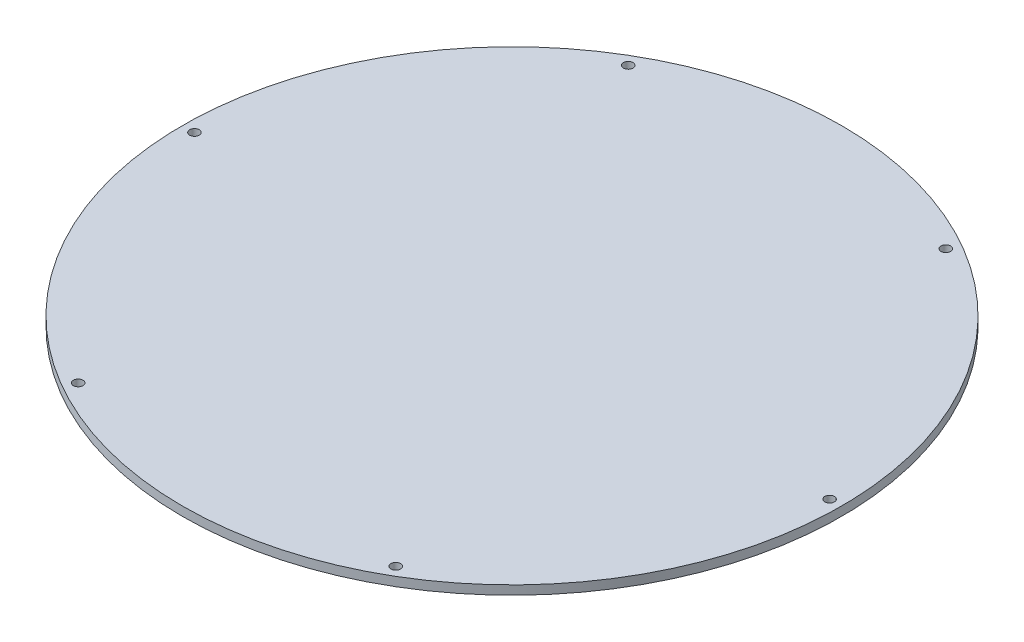
ISO-10303-21;
HEADER;
FILE_DESCRIPTION(('STEP AP214'),'2;1');
FILE_NAME('part.step','',(''),(''),'','','');
FILE_SCHEMA(('AUTOMOTIVE_DESIGN { 1 0 10303 214 1 1 1 1 }'));
ENDSEC;
DATA;
#1=APPLICATION_CONTEXT('core data for automotive mechanical design processes');
#2=APPLICATION_PROTOCOL_DEFINITION('international standard','automotive_design',2000,#1);
#3=PRODUCT_CONTEXT('',#1,'mechanical');
#4=PRODUCT('Part','Part','',(#3));
#5=PRODUCT_RELATED_PRODUCT_CATEGORY('part','',(#4));
#6=PRODUCT_DEFINITION_FORMATION('','',#4);
#7=PRODUCT_DEFINITION_CONTEXT('part definition',#1,'design');
#8=PRODUCT_DEFINITION('design','',#6,#7);
#9=PRODUCT_DEFINITION_SHAPE('','',#8);
#10=(LENGTH_UNIT() NAMED_UNIT(*) SI_UNIT(.MILLI.,.METRE.));
#11=(NAMED_UNIT(*) PLANE_ANGLE_UNIT() SI_UNIT($,.RADIAN.));
#12=(NAMED_UNIT(*) SI_UNIT($,.STERADIAN.) SOLID_ANGLE_UNIT());
#13=UNCERTAINTY_MEASURE_WITH_UNIT(LENGTH_MEASURE(1.E-05),#10,'distance_accuracy_value','');
#14=(GEOMETRIC_REPRESENTATION_CONTEXT(3) GLOBAL_UNCERTAINTY_ASSIGNED_CONTEXT((#13)) GLOBAL_UNIT_ASSIGNED_CONTEXT((#10,
#11,#12)) REPRESENTATION_CONTEXT('',''));
#15=CARTESIAN_POINT('',(0.,0.,0.));
#16=DIRECTION('',(0.,0.,1.));
#17=DIRECTION('',(1.,0.,0.));
#18=AXIS2_PLACEMENT_3D('',#15,#16,#17);
#19=CARTESIAN_POINT('',(0.,3.,0.));
#20=DIRECTION('',(0.,-1.,0.));
#21=DIRECTION('',(0.,0.,-1.));
#22=AXIS2_PLACEMENT_3D('',#19,#20,#21);
#23=CYLINDRICAL_SURFACE('',#22,110.);
#24=CARTESIAN_POINT('',(0.,3.,0.));
#25=DIRECTION('',(0.,1.,0.));
#26=DIRECTION('',(0.,0.,1.));
#27=AXIS2_PLACEMENT_3D('',#24,#25,#26);
#28=CIRCLE('',#27,110.);
#29=CARTESIAN_POINT('',(0.,3.,110.));
#30=VERTEX_POINT('',#29);
#31=EDGE_CURVE('E10',#30,#30,#28,.T.);
#32=ORIENTED_EDGE('',*,*,#31,.F.);
#33=EDGE_LOOP('',(#32));
#34=FACE_BOUND('',#33,.T.);
#35=CARTESIAN_POINT('',(0.,0.,0.));
#36=DIRECTION('',(0.,1.,0.));
#37=DIRECTION('',(0.,0.,1.));
#38=AXIS2_PLACEMENT_3D('',#35,#36,#37);
#39=CIRCLE('',#38,110.);
#40=CARTESIAN_POINT('',(0.,0.,110.));
#41=VERTEX_POINT('',#40);
#42=EDGE_CURVE('E37',#41,#41,#39,.T.);
#43=ORIENTED_EDGE('',*,*,#42,.T.);
#44=EDGE_LOOP('',(#43));
#45=FACE_BOUND('',#44,.T.);
#46=ADVANCED_FACE('F34',(#34,#45),#23,.T.);
#47=CARTESIAN_POINT('',(0.,3.,0.));
#48=DIRECTION('',(0.,1.,0.));
#49=DIRECTION('',(0.,0.,1.));
#50=AXIS2_PLACEMENT_3D('',#47,#48,#49);
#51=PLANE('',#50);
#52=CARTESIAN_POINT('',(-52.9999999999977,3.,-91.7986928011466));
#53=DIRECTION('',(0.,1.,0.));
#54=DIRECTION('',(0.,0.,1.));
#55=AXIS2_PLACEMENT_3D('',#52,#53,#54);
#56=CIRCLE('',#55,1.60000000000001);
#57=CARTESIAN_POINT('',(-52.9999999999977,3.,-90.1986928011466));
#58=VERTEX_POINT('',#57);
#59=EDGE_CURVE('E52',#58,#58,#56,.T.);
#60=ORIENTED_EDGE('',*,*,#59,.F.);
#61=EDGE_LOOP('',(#60));
#62=FACE_BOUND('',#61,.T.);
#63=CARTESIAN_POINT('',(-105.999999999993,3.,3.79557496543725E-12));
#64=DIRECTION('',(0.,1.,0.));
#65=DIRECTION('',(0.,0.,1.));
#66=AXIS2_PLACEMENT_3D('',#63,#64,#65);
#67=CIRCLE('',#66,1.60000000000001);
#68=CARTESIAN_POINT('',(-105.999999999993,3.,1.6000000000038));
#69=VERTEX_POINT('',#68);
#70=EDGE_CURVE('E58',#69,#69,#67,.T.);
#71=ORIENTED_EDGE('',*,*,#70,.F.);
#72=EDGE_LOOP('',(#71));
#73=FACE_BOUND('',#72,.T.);
#74=CARTESIAN_POINT('',(-52.9999999999911,3.,91.7986928011504));
#75=DIRECTION('',(0.,1.,0.));
#76=DIRECTION('',(0.,0.,1.));
#77=AXIS2_PLACEMENT_3D('',#74,#75,#76);
#78=CIRCLE('',#77,1.60000000000001);
#79=CARTESIAN_POINT('',(-52.9999999999911,3.,93.3986928011504));
#80=VERTEX_POINT('',#79);
#81=EDGE_CURVE('E64',#80,#80,#78,.T.);
#82=ORIENTED_EDGE('',*,*,#81,.F.);
#83=EDGE_LOOP('',(#82));
#84=FACE_BOUND('',#83,.T.);
#85=CARTESIAN_POINT('',(53.0000000000066,3.,91.7986928011466));
#86=DIRECTION('',(0.,1.,0.));
#87=DIRECTION('',(0.,0.,1.));
#88=AXIS2_PLACEMENT_3D('',#85,#86,#87);
#89=CIRCLE('',#88,1.60000000000001);
#90=CARTESIAN_POINT('',(53.0000000000066,3.,93.3986928011467));
#91=VERTEX_POINT('',#90);
#92=EDGE_CURVE('E70',#91,#91,#89,.T.);
#93=ORIENTED_EDGE('',*,*,#92,.F.);
#94=EDGE_LOOP('',(#93));
#95=FACE_BOUND('',#94,.T.);
#96=CARTESIAN_POINT('',(106.000000000002,3.,-3.78169717762944E-12));
#97=DIRECTION('',(0.,1.,0.));
#98=DIRECTION('',(0.,0.,1.));
#99=AXIS2_PLACEMENT_3D('',#96,#97,#98);
#100=CIRCLE('',#99,1.60000000000001);
#101=CARTESIAN_POINT('',(106.000000000002,3.,1.59999999999622));
#102=VERTEX_POINT('',#101);
#103=EDGE_CURVE('E76',#102,#102,#100,.T.);
#104=ORIENTED_EDGE('',*,*,#103,.F.);
#105=EDGE_LOOP('',(#104));
#106=FACE_BOUND('',#105,.T.);
#107=CARTESIAN_POINT('',(53.0000000000001,3.,-91.7986928011504));
#108=DIRECTION('',(0.,1.,0.));
#109=DIRECTION('',(0.,0.,1.));
#110=AXIS2_PLACEMENT_3D('',#107,#108,#109);
#111=CIRCLE('',#110,1.60000000000001);
#112=CARTESIAN_POINT('',(53.0000000000001,3.,-90.1986928011504));
#113=VERTEX_POINT('',#112);
#114=EDGE_CURVE('E46',#113,#113,#111,.T.);
#115=ORIENTED_EDGE('',*,*,#114,.F.);
#116=EDGE_LOOP('',(#115));
#117=FACE_BOUND('',#116,.T.);
#118=ORIENTED_EDGE('',*,*,#31,.T.);
#119=EDGE_LOOP('',(#118));
#120=FACE_BOUND('',#119,.T.);
#121=ADVANCED_FACE('F93',(#62,#73,#84,#95,#106,#117,#120),#51,.T.);
#122=CARTESIAN_POINT('',(0.,0.,0.));
#123=DIRECTION('',(0.,1.,0.));
#124=DIRECTION('',(0.,0.,1.));
#125=AXIS2_PLACEMENT_3D('',#122,#123,#124);
#126=PLANE('',#125);
#127=CARTESIAN_POINT('',(-52.9999999999977,0.,-91.7986928011466));
#128=DIRECTION('',(0.,1.,0.));
#129=DIRECTION('',(0.,0.,1.));
#130=AXIS2_PLACEMENT_3D('',#127,#128,#129);
#131=CIRCLE('',#130,1.60000000000001);
#132=CARTESIAN_POINT('',(-52.9999999999977,0.,-90.1986928011466));
#133=VERTEX_POINT('',#132);
#134=EDGE_CURVE('E55',#133,#133,#131,.T.);
#135=ORIENTED_EDGE('',*,*,#134,.T.);
#136=EDGE_LOOP('',(#135));
#137=FACE_BOUND('',#136,.T.);
#138=CARTESIAN_POINT('',(-105.999999999993,0.,3.79557496543725E-12));
#139=DIRECTION('',(0.,1.,0.));
#140=DIRECTION('',(0.,0.,1.));
#141=AXIS2_PLACEMENT_3D('',#138,#139,#140);
#142=CIRCLE('',#141,1.60000000000001);
#143=CARTESIAN_POINT('',(-105.999999999993,0.,1.6000000000038));
#144=VERTEX_POINT('',#143);
#145=EDGE_CURVE('E61',#144,#144,#142,.T.);
#146=ORIENTED_EDGE('',*,*,#145,.T.);
#147=EDGE_LOOP('',(#146));
#148=FACE_BOUND('',#147,.T.);
#149=CARTESIAN_POINT('',(-52.9999999999911,0.,91.7986928011504));
#150=DIRECTION('',(0.,1.,0.));
#151=DIRECTION('',(0.,0.,1.));
#152=AXIS2_PLACEMENT_3D('',#149,#150,#151);
#153=CIRCLE('',#152,1.60000000000001);
#154=CARTESIAN_POINT('',(-52.9999999999911,0.,93.3986928011504));
#155=VERTEX_POINT('',#154);
#156=EDGE_CURVE('E67',#155,#155,#153,.T.);
#157=ORIENTED_EDGE('',*,*,#156,.T.);
#158=EDGE_LOOP('',(#157));
#159=FACE_BOUND('',#158,.T.);
#160=CARTESIAN_POINT('',(53.0000000000066,0.,91.7986928011466));
#161=DIRECTION('',(0.,1.,0.));
#162=DIRECTION('',(0.,0.,1.));
#163=AXIS2_PLACEMENT_3D('',#160,#161,#162);
#164=CIRCLE('',#163,1.60000000000001);
#165=CARTESIAN_POINT('',(53.0000000000066,0.,93.3986928011467));
#166=VERTEX_POINT('',#165);
#167=EDGE_CURVE('E73',#166,#166,#164,.T.);
#168=ORIENTED_EDGE('',*,*,#167,.T.);
#169=EDGE_LOOP('',(#168));
#170=FACE_BOUND('',#169,.T.);
#171=CARTESIAN_POINT('',(106.000000000002,0.,-3.78169717762944E-12));
#172=DIRECTION('',(0.,1.,0.));
#173=DIRECTION('',(0.,0.,1.));
#174=AXIS2_PLACEMENT_3D('',#171,#172,#173);
#175=CIRCLE('',#174,1.60000000000001);
#176=CARTESIAN_POINT('',(106.000000000002,0.,1.59999999999622));
#177=VERTEX_POINT('',#176);
#178=EDGE_CURVE('E49',#177,#177,#175,.T.);
#179=ORIENTED_EDGE('',*,*,#178,.T.);
#180=EDGE_LOOP('',(#179));
#181=FACE_BOUND('',#180,.T.);
#182=CARTESIAN_POINT('',(53.0000000000001,0.,-91.7986928011504));
#183=DIRECTION('',(0.,1.,0.));
#184=DIRECTION('',(0.,0.,1.));
#185=AXIS2_PLACEMENT_3D('',#182,#183,#184);
#186=CIRCLE('',#185,1.60000000000001);
#187=CARTESIAN_POINT('',(53.0000000000001,0.,-90.1986928011504));
#188=VERTEX_POINT('',#187);
#189=EDGE_CURVE('E44',#188,#188,#186,.T.);
#190=ORIENTED_EDGE('',*,*,#189,.T.);
#191=EDGE_LOOP('',(#190));
#192=FACE_BOUND('',#191,.T.);
#193=ORIENTED_EDGE('',*,*,#42,.F.);
#194=EDGE_LOOP('',(#193));
#195=FACE_BOUND('',#194,.T.);
#196=ADVANCED_FACE('F82',(#137,#148,#159,#170,#181,#192,#195),#126,.F.);
#197=CARTESIAN_POINT('',(53.0000000000001,0.,-91.7986928011504));
#198=DIRECTION('',(0.,1.,0.));
#199=DIRECTION('',(0.,0.,1.));
#200=AXIS2_PLACEMENT_3D('',#197,#198,#199);
#201=CYLINDRICAL_SURFACE('',#200,1.60000000000001);
#202=ORIENTED_EDGE('',*,*,#189,.F.);
#203=EDGE_LOOP('',(#202));
#204=FACE_BOUND('',#203,.T.);
#205=ORIENTED_EDGE('',*,*,#114,.T.);
#206=EDGE_LOOP('',(#205));
#207=FACE_BOUND('',#206,.T.);
#208=ADVANCED_FACE('F89',(#204,#207),#201,.F.);
#209=CARTESIAN_POINT('',(106.000000000002,0.,-3.78169717762944E-12));
#210=DIRECTION('',(0.,1.,0.));
#211=DIRECTION('',(0.,0.,1.));
#212=AXIS2_PLACEMENT_3D('',#209,#210,#211);
#213=CYLINDRICAL_SURFACE('',#212,1.60000000000001);
#214=ORIENTED_EDGE('',*,*,#178,.F.);
#215=EDGE_LOOP('',(#214));
#216=FACE_BOUND('',#215,.T.);
#217=ORIENTED_EDGE('',*,*,#103,.T.);
#218=EDGE_LOOP('',(#217));
#219=FACE_BOUND('',#218,.T.);
#220=ADVANCED_FACE('F85',(#216,#219),#213,.F.);
#221=CARTESIAN_POINT('',(53.0000000000066,0.,91.7986928011466));
#222=DIRECTION('',(0.,1.,0.));
#223=DIRECTION('',(0.,0.,1.));
#224=AXIS2_PLACEMENT_3D('',#221,#222,#223);
#225=CYLINDRICAL_SURFACE('',#224,1.60000000000001);
#226=ORIENTED_EDGE('',*,*,#167,.F.);
#227=EDGE_LOOP('',(#226));
#228=FACE_BOUND('',#227,.T.);
#229=ORIENTED_EDGE('',*,*,#92,.T.);
#230=EDGE_LOOP('',(#229));
#231=FACE_BOUND('',#230,.T.);
#232=ADVANCED_FACE('F88',(#228,#231),#225,.F.);
#233=CARTESIAN_POINT('',(-52.9999999999911,0.,91.7986928011504));
#234=DIRECTION('',(0.,1.,0.));
#235=DIRECTION('',(0.,0.,1.));
#236=AXIS2_PLACEMENT_3D('',#233,#234,#235);
#237=CYLINDRICAL_SURFACE('',#236,1.60000000000001);
#238=ORIENTED_EDGE('',*,*,#156,.F.);
#239=EDGE_LOOP('',(#238));
#240=FACE_BOUND('',#239,.T.);
#241=ORIENTED_EDGE('',*,*,#81,.T.);
#242=EDGE_LOOP('',(#241));
#243=FACE_BOUND('',#242,.T.);
#244=ADVANCED_FACE('F143',(#240,#243),#237,.F.);
#245=CARTESIAN_POINT('',(-105.999999999993,0.,3.79557496543725E-12));
#246=DIRECTION('',(0.,1.,0.));
#247=DIRECTION('',(0.,0.,1.));
#248=AXIS2_PLACEMENT_3D('',#245,#246,#247);
#249=CYLINDRICAL_SURFACE('',#248,1.60000000000001);
#250=ORIENTED_EDGE('',*,*,#145,.F.);
#251=EDGE_LOOP('',(#250));
#252=FACE_BOUND('',#251,.T.);
#253=ORIENTED_EDGE('',*,*,#70,.T.);
#254=EDGE_LOOP('',(#253));
#255=FACE_BOUND('',#254,.T.);
#256=ADVANCED_FACE('F153',(#252,#255),#249,.F.);
#257=CARTESIAN_POINT('',(-52.9999999999977,0.,-91.7986928011466));
#258=DIRECTION('',(0.,1.,0.));
#259=DIRECTION('',(0.,0.,1.));
#260=AXIS2_PLACEMENT_3D('',#257,#258,#259);
#261=CYLINDRICAL_SURFACE('',#260,1.60000000000001);
#262=ORIENTED_EDGE('',*,*,#134,.F.);
#263=EDGE_LOOP('',(#262));
#264=FACE_BOUND('',#263,.T.);
#265=ORIENTED_EDGE('',*,*,#59,.T.);
#266=EDGE_LOOP('',(#265));
#267=FACE_BOUND('',#266,.T.);
#268=ADVANCED_FACE('F163',(#264,#267),#261,.F.);
#269=CLOSED_SHELL('',(#46,#121,#196,#208,#220,#232,#244,#256,#268));
#270=MANIFOLD_SOLID_BREP('B2',#269);
#271=ADVANCED_BREP_SHAPE_REPRESENTATION('',(#18,#270),#14);
#272=SHAPE_DEFINITION_REPRESENTATION(#9,#271);
ENDSEC;
END-ISO-10303-21;
